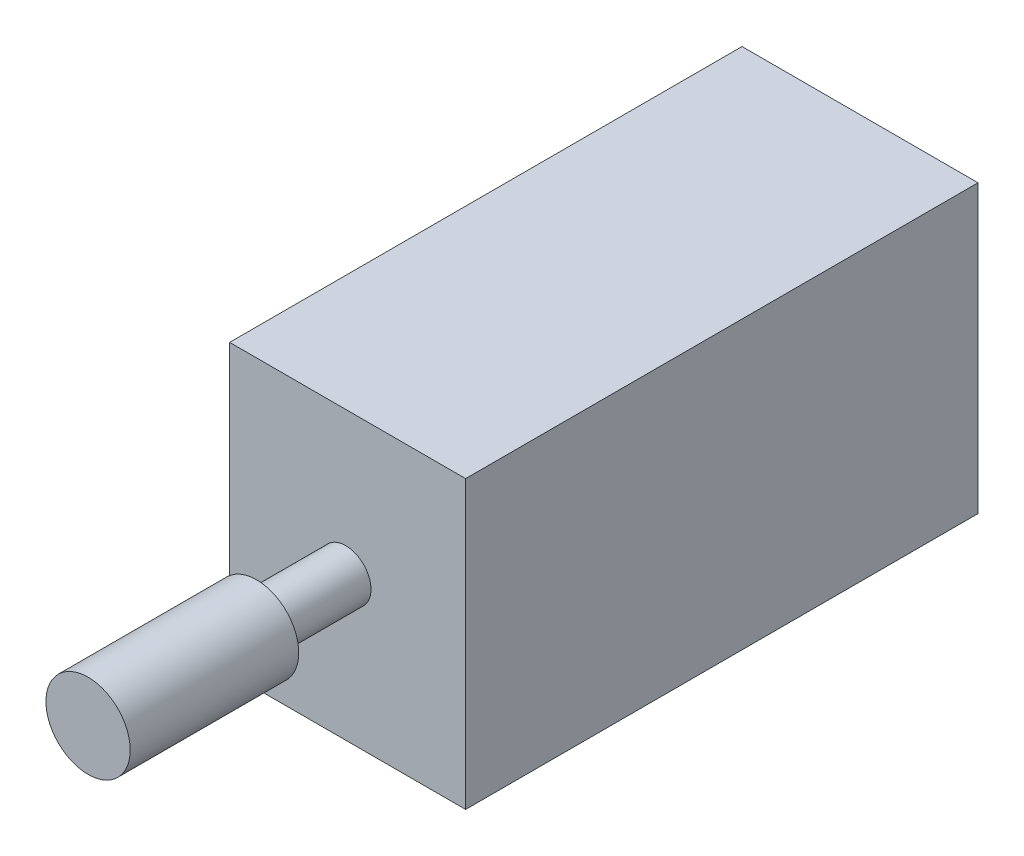
ISO-10303-21;
HEADER;
FILE_DESCRIPTION(('STEP AP214'),'2;1');
FILE_NAME('part.step','',(''),(''),'','','');
FILE_SCHEMA(('AUTOMOTIVE_DESIGN { 1 0 10303 214 1 1 1 1 }'));
ENDSEC;
DATA;
#1=APPLICATION_CONTEXT('core data for automotive mechanical design processes');
#2=APPLICATION_PROTOCOL_DEFINITION('international standard','automotive_design',2000,#1);
#3=PRODUCT_CONTEXT('',#1,'mechanical');
#4=PRODUCT('Part','Part','',(#3));
#5=PRODUCT_RELATED_PRODUCT_CATEGORY('part','',(#4));
#6=PRODUCT_DEFINITION_FORMATION('','',#4);
#7=PRODUCT_DEFINITION_CONTEXT('part definition',#1,'design');
#8=PRODUCT_DEFINITION('design','',#6,#7);
#9=PRODUCT_DEFINITION_SHAPE('','',#8);
#10=(LENGTH_UNIT() NAMED_UNIT(*) SI_UNIT(.MILLI.,.METRE.));
#11=(NAMED_UNIT(*) PLANE_ANGLE_UNIT() SI_UNIT($,.RADIAN.));
#12=(NAMED_UNIT(*) SI_UNIT($,.STERADIAN.) SOLID_ANGLE_UNIT());
#13=UNCERTAINTY_MEASURE_WITH_UNIT(LENGTH_MEASURE(1.E-05),#10,'distance_accuracy_value','');
#14=(GEOMETRIC_REPRESENTATION_CONTEXT(3) GLOBAL_UNCERTAINTY_ASSIGNED_CONTEXT((#13)) GLOBAL_UNIT_ASSIGNED_CONTEXT((#10,
#11,#12)) REPRESENTATION_CONTEXT('',''));
#15=CARTESIAN_POINT('',(0.,0.,0.));
#16=DIRECTION('',(0.,0.,1.));
#17=DIRECTION('',(1.,0.,0.));
#18=AXIS2_PLACEMENT_3D('',#15,#16,#17);
#19=CARTESIAN_POINT('',(14.,-8.49999999999992,15.2));
#20=DIRECTION('',(0.,0.,-1.));
#21=DIRECTION('',(-1.,0.,0.));
#22=AXIS2_PLACEMENT_3D('',#19,#20,#21);
#23=PLANE('',#22);
#24=CARTESIAN_POINT('',(6.88711981007908,0.,15.2));
#25=DIRECTION('',(0.,0.,-1.));
#26=DIRECTION('',(-1.,0.,0.));
#27=AXIS2_PLACEMENT_3D('',#24,#25,#26);
#28=CIRCLE('',#27,1.5);
#29=CARTESIAN_POINT('',(5.38711981007908,0.,15.2));
#30=VERTEX_POINT('',#29);
#31=EDGE_CURVE('E11',#30,#30,#28,.F.);
#32=ORIENTED_EDGE('',*,*,#31,.F.);
#33=EDGE_LOOP('',(#32));
#34=FACE_BOUND('',#33,.T.);
#35=DIRECTION('',(0.,-1.,0.));
#36=VECTOR('',#35,1.);
#37=CARTESIAN_POINT('',(0.,-8.49999999999992,15.2));
#38=LINE('',#37,#36);
#39=CARTESIAN_POINT('',(0.,8.50000000000004,15.2));
#40=VERTEX_POINT('',#39);
#41=CARTESIAN_POINT('',(0.,-8.49999999999992,15.2));
#42=VERTEX_POINT('',#41);
#43=EDGE_CURVE('E110',#40,#42,#38,.T.);
#44=ORIENTED_EDGE('',*,*,#43,.T.);
#45=DIRECTION('',(-1.,0.,0.));
#46=VECTOR('',#45,1.);
#47=CARTESIAN_POINT('',(14.,-8.49999999999992,15.2));
#48=LINE('',#47,#46);
#49=CARTESIAN_POINT('',(14.,-8.49999999999992,15.2));
#50=VERTEX_POINT('',#49);
#51=EDGE_CURVE('E48',#50,#42,#48,.T.);
#52=ORIENTED_EDGE('',*,*,#51,.F.);
#53=DIRECTION('',(0.,-1.,0.));
#54=VECTOR('',#53,1.);
#55=CARTESIAN_POINT('',(14.,-8.49999999999992,15.2));
#56=LINE('',#55,#54);
#57=CARTESIAN_POINT('',(14.,8.50000000000004,15.2));
#58=VERTEX_POINT('',#57);
#59=EDGE_CURVE('E92',#58,#50,#56,.T.);
#60=ORIENTED_EDGE('',*,*,#59,.F.);
#61=DIRECTION('',(-1.,0.,0.));
#62=VECTOR('',#61,1.);
#63=CARTESIAN_POINT('',(14.,8.50000000000004,15.2));
#64=LINE('',#63,#62);
#65=EDGE_CURVE('E106',#58,#40,#64,.T.);
#66=ORIENTED_EDGE('',*,*,#65,.T.);
#67=EDGE_LOOP('',(#44,#52,#60,#66));
#68=FACE_BOUND('',#67,.T.);
#69=ADVANCED_FACE('F39',(#34,#68),#23,.F.);
#70=CARTESIAN_POINT('',(14.,-8.49999999999992,-15.2));
#71=DIRECTION('',(0.,1.,0.));
#72=DIRECTION('',(0.,0.,1.));
#73=AXIS2_PLACEMENT_3D('',#70,#71,#72);
#74=PLANE('',#73);
#75=DIRECTION('',(0.,0.,-1.));
#76=VECTOR('',#75,1.);
#77=CARTESIAN_POINT('',(0.,-8.49999999999992,-15.2));
#78=LINE('',#77,#76);
#79=CARTESIAN_POINT('',(0.,-8.49999999999992,-15.2));
#80=VERTEX_POINT('',#79);
#81=EDGE_CURVE('E98',#42,#80,#78,.T.);
#82=ORIENTED_EDGE('',*,*,#81,.T.);
#83=DIRECTION('',(-1.,0.,0.));
#84=VECTOR('',#83,1.);
#85=CARTESIAN_POINT('',(14.,-8.49999999999992,-15.2));
#86=LINE('',#85,#84);
#87=CARTESIAN_POINT('',(14.,-8.49999999999992,-15.2));
#88=VERTEX_POINT('',#87);
#89=EDGE_CURVE('E96',#88,#80,#86,.T.);
#90=ORIENTED_EDGE('',*,*,#89,.F.);
#91=DIRECTION('',(0.,0.,-1.));
#92=VECTOR('',#91,1.);
#93=CARTESIAN_POINT('',(14.,-8.49999999999992,-15.2));
#94=LINE('',#93,#92);
#95=EDGE_CURVE('E87',#50,#88,#94,.T.);
#96=ORIENTED_EDGE('',*,*,#95,.F.);
#97=ORIENTED_EDGE('',*,*,#51,.T.);
#98=EDGE_LOOP('',(#82,#90,#96,#97));
#99=FACE_BOUND('',#98,.T.);
#100=ADVANCED_FACE('F97',(#99),#74,.F.);
#101=CARTESIAN_POINT('',(14.,-8.49999999999992,-15.2));
#102=DIRECTION('',(0.,0.,1.));
#103=DIRECTION('',(1.,0.,0.));
#104=AXIS2_PLACEMENT_3D('',#101,#102,#103);
#105=PLANE('',#104);
#106=DIRECTION('',(0.,1.,0.));
#107=VECTOR('',#106,1.);
#108=CARTESIAN_POINT('',(0.,-8.49999999999992,-15.2));
#109=LINE('',#108,#107);
#110=CARTESIAN_POINT('',(0.,8.50000000000006,-15.2));
#111=VERTEX_POINT('',#110);
#112=EDGE_CURVE('E73',#80,#111,#109,.T.);
#113=ORIENTED_EDGE('',*,*,#112,.T.);
#114=DIRECTION('',(-1.,0.,0.));
#115=VECTOR('',#114,1.);
#116=CARTESIAN_POINT('',(14.,8.50000000000006,-15.2));
#117=LINE('',#116,#115);
#118=CARTESIAN_POINT('',(14.,8.50000000000006,-15.2));
#119=VERTEX_POINT('',#118);
#120=EDGE_CURVE('E100',#119,#111,#117,.T.);
#121=ORIENTED_EDGE('',*,*,#120,.F.);
#122=DIRECTION('',(0.,1.,0.));
#123=VECTOR('',#122,1.);
#124=CARTESIAN_POINT('',(14.,-8.49999999999992,-15.2));
#125=LINE('',#124,#123);
#126=EDGE_CURVE('E90',#88,#119,#125,.T.);
#127=ORIENTED_EDGE('',*,*,#126,.F.);
#128=ORIENTED_EDGE('',*,*,#89,.T.);
#129=EDGE_LOOP('',(#113,#121,#127,#128));
#130=FACE_BOUND('',#129,.T.);
#131=ADVANCED_FACE('F102',(#130),#105,.F.);
#132=CARTESIAN_POINT('',(14.,8.50000000000006,-15.2));
#133=DIRECTION('',(0.,-1.,0.));
#134=DIRECTION('',(0.,0.,-1.));
#135=AXIS2_PLACEMENT_3D('',#132,#133,#134);
#136=PLANE('',#135);
#137=DIRECTION('',(0.,0.,1.));
#138=VECTOR('',#137,1.);
#139=CARTESIAN_POINT('',(0.,8.50000000000006,-15.2));
#140=LINE('',#139,#138);
#141=EDGE_CURVE('E79',#111,#40,#140,.T.);
#142=ORIENTED_EDGE('',*,*,#141,.T.);
#143=ORIENTED_EDGE('',*,*,#65,.F.);
#144=DIRECTION('',(0.,0.,1.));
#145=VECTOR('',#144,1.);
#146=CARTESIAN_POINT('',(14.,8.50000000000006,-15.2));
#147=LINE('',#146,#145);
#148=EDGE_CURVE('E56',#119,#58,#147,.T.);
#149=ORIENTED_EDGE('',*,*,#148,.F.);
#150=ORIENTED_EDGE('',*,*,#120,.T.);
#151=EDGE_LOOP('',(#142,#143,#149,#150));
#152=FACE_BOUND('',#151,.T.);
#153=ADVANCED_FACE('F139',(#152),#136,.F.);
#154=CARTESIAN_POINT('',(14.,0.,0.));
#155=DIRECTION('',(1.,0.,0.));
#156=DIRECTION('',(0.,0.,-1.));
#157=AXIS2_PLACEMENT_3D('',#154,#155,#156);
#158=PLANE('',#157);
#159=ORIENTED_EDGE('',*,*,#59,.T.);
#160=ORIENTED_EDGE('',*,*,#95,.T.);
#161=ORIENTED_EDGE('',*,*,#126,.T.);
#162=ORIENTED_EDGE('',*,*,#148,.T.);
#163=EDGE_LOOP('',(#159,#160,#161,#162));
#164=FACE_BOUND('',#163,.T.);
#165=ADVANCED_FACE('F88',(#164),#158,.T.);
#166=CARTESIAN_POINT('',(0.,0.,0.));
#167=DIRECTION('',(1.,0.,0.));
#168=DIRECTION('',(0.,0.,-1.));
#169=AXIS2_PLACEMENT_3D('',#166,#167,#168);
#170=PLANE('',#169);
#171=ORIENTED_EDGE('',*,*,#43,.F.);
#172=ORIENTED_EDGE('',*,*,#141,.F.);
#173=ORIENTED_EDGE('',*,*,#112,.F.);
#174=ORIENTED_EDGE('',*,*,#81,.F.);
#175=EDGE_LOOP('',(#171,#172,#173,#174));
#176=FACE_BOUND('',#175,.T.);
#177=ADVANCED_FACE('F128',(#176),#170,.F.);
#178=CARTESIAN_POINT('',(6.88711981007908,0.,20.6));
#179=DIRECTION('',(0.,0.,-1.));
#180=DIRECTION('',(-1.,0.,0.));
#181=AXIS2_PLACEMENT_3D('',#178,#179,#180);
#182=CYLINDRICAL_SURFACE('',#181,1.5);
#183=CARTESIAN_POINT('',(6.88711981007908,0.,20.6));
#184=DIRECTION('',(0.,0.,1.));
#185=DIRECTION('',(1.,0.,0.));
#186=AXIS2_PLACEMENT_3D('',#183,#184,#185);
#187=CIRCLE('',#186,1.5);
#188=CARTESIAN_POINT('',(5.38711981007908,0.,20.6));
#189=VERTEX_POINT('',#188);
#190=EDGE_CURVE('E114',#189,#189,#187,.T.);
#191=CARTESIAN_POINT('',(5.38711981007908,0.,20.6));
#192=CARTESIAN_POINT('',(5.38711981007908,0.,20.54375));
#193=CARTESIAN_POINT('',(5.38711981007908,0.,20.4875));
#194=CARTESIAN_POINT('',(5.38711981007908,0.,20.375));
#195=CARTESIAN_POINT('',(5.38711981007908,0.,20.31875));
#196=CARTESIAN_POINT('',(5.38711981007908,0.,20.20625));
#197=CARTESIAN_POINT('',(5.38711981007908,0.,20.15));
#198=CARTESIAN_POINT('',(5.38711981007908,0.,20.0375));
#199=CARTESIAN_POINT('',(5.38711981007908,0.,19.98125));
#200=CARTESIAN_POINT('',(5.38711981007908,0.,19.86875));
#201=CARTESIAN_POINT('',(5.38711981007908,0.,19.8125));
#202=CARTESIAN_POINT('',(5.38711981007908,0.,19.7));
#203=CARTESIAN_POINT('',(5.38711981007908,0.,19.64375));
#204=CARTESIAN_POINT('',(5.38711981007908,0.,19.53125));
#205=CARTESIAN_POINT('',(5.38711981007908,0.,19.475));
#206=CARTESIAN_POINT('',(5.38711981007908,0.,19.3625));
#207=CARTESIAN_POINT('',(5.38711981007908,0.,19.30625));
#208=CARTESIAN_POINT('',(5.38711981007908,0.,19.19375));
#209=CARTESIAN_POINT('',(5.38711981007908,0.,19.1375));
#210=CARTESIAN_POINT('',(5.38711981007908,0.,19.025));
#211=CARTESIAN_POINT('',(5.38711981007908,0.,18.96875));
#212=CARTESIAN_POINT('',(5.38711981007908,0.,18.85625));
#213=CARTESIAN_POINT('',(5.38711981007908,0.,18.8));
#214=CARTESIAN_POINT('',(5.38711981007908,0.,18.6875));
#215=CARTESIAN_POINT('',(5.38711981007908,0.,18.63125));
#216=CARTESIAN_POINT('',(5.38711981007908,0.,18.51875));
#217=CARTESIAN_POINT('',(5.38711981007908,0.,18.4625));
#218=CARTESIAN_POINT('',(5.38711981007908,0.,18.35));
#219=CARTESIAN_POINT('',(5.38711981007908,0.,18.29375));
#220=CARTESIAN_POINT('',(5.38711981007908,0.,18.18125));
#221=CARTESIAN_POINT('',(5.38711981007908,0.,18.125));
#222=CARTESIAN_POINT('',(5.38711981007908,0.,18.0125));
#223=CARTESIAN_POINT('',(5.38711981007908,0.,17.95625));
#224=CARTESIAN_POINT('',(5.38711981007908,0.,17.84375));
#225=CARTESIAN_POINT('',(5.38711981007908,0.,17.7875));
#226=CARTESIAN_POINT('',(5.38711981007908,0.,17.675));
#227=CARTESIAN_POINT('',(5.38711981007908,0.,17.61875));
#228=CARTESIAN_POINT('',(5.38711981007908,0.,17.50625));
#229=CARTESIAN_POINT('',(5.38711981007908,0.,17.45));
#230=CARTESIAN_POINT('',(5.38711981007908,0.,17.3375));
#231=CARTESIAN_POINT('',(5.38711981007908,0.,17.28125));
#232=CARTESIAN_POINT('',(5.38711981007908,0.,17.16875));
#233=CARTESIAN_POINT('',(5.38711981007908,0.,17.1125));
#234=CARTESIAN_POINT('',(5.38711981007908,0.,17.));
#235=CARTESIAN_POINT('',(5.38711981007908,0.,16.94375));
#236=CARTESIAN_POINT('',(5.38711981007908,0.,16.83125));
#237=CARTESIAN_POINT('',(5.38711981007908,0.,16.775));
#238=CARTESIAN_POINT('',(5.38711981007908,0.,16.6625));
#239=CARTESIAN_POINT('',(5.38711981007908,0.,16.60625));
#240=CARTESIAN_POINT('',(5.38711981007908,0.,16.49375));
#241=CARTESIAN_POINT('',(5.38711981007908,0.,16.4375));
#242=CARTESIAN_POINT('',(5.38711981007908,0.,16.325));
#243=CARTESIAN_POINT('',(5.38711981007908,0.,16.26875));
#244=CARTESIAN_POINT('',(5.38711981007908,0.,16.15625));
#245=CARTESIAN_POINT('',(5.38711981007908,0.,16.1));
#246=CARTESIAN_POINT('',(5.38711981007908,0.,15.9875));
#247=CARTESIAN_POINT('',(5.38711981007908,0.,15.93125));
#248=CARTESIAN_POINT('',(5.38711981007908,0.,15.81875));
#249=CARTESIAN_POINT('',(5.38711981007908,0.,15.7625));
#250=CARTESIAN_POINT('',(5.38711981007908,0.,15.65));
#251=CARTESIAN_POINT('',(5.38711981007908,0.,15.59375));
#252=CARTESIAN_POINT('',(5.38711981007908,0.,15.48125));
#253=CARTESIAN_POINT('',(5.38711981007908,0.,15.425));
#254=CARTESIAN_POINT('',(5.38711981007908,0.,15.3125));
#255=CARTESIAN_POINT('',(5.38711981007908,0.,15.25625));
#256=CARTESIAN_POINT('',(5.38711981007908,0.,15.2));
#257=B_SPLINE_CURVE_WITH_KNOTS('',3,(#191,#192,#193,#194,#195,#196,#197,#198,#199,#200,#201,
#202,#203,#204,#205,#206,#207,#208,#209,#210,#211,#212,#213,#214,#215,#216,#217,#218,#219,#220,
#221,#222,#223,#224,#225,#226,#227,#228,#229,#230,#231,#232,#233,#234,#235,#236,#237,#238,#239,
#240,#241,#242,#243,#244,#245,#246,#247,#248,#249,#250,#251,#252,#253,#254,#255,#256),
.UNSPECIFIED.,.F.,.F.,(4,2,2,2,2,2,2,2,2,2,2,2,2,2,2,2,2,2,2,2,2,2,2,2,2,2,2,2,2,2,2,2,4),(0.,
0.168749999999999,0.337499999999998,0.506249999999996,0.674999999999998,0.843749999999997,
1.0125,1.18125,1.35,1.51875,1.6875,1.85625,2.025,2.19375,2.3625,2.53125,2.7,2.86875,3.0375,
3.20625,3.375,3.54374999999999,3.7125,3.88125,4.04999999999999,4.21875,4.3875,4.55624999999999,
4.725,4.89375,5.06249999999999,5.23124999999999,5.4),.UNSPECIFIED.);
#258=EDGE_CURVE('BSEAM130',#189,#30,#257,.T.);
#259=ORIENTED_EDGE('',*,*,#190,.F.);
#260=ORIENTED_EDGE('',*,*,#31,.T.);
#261=ORIENTED_EDGE('',*,*,#258,.T.);
#262=ORIENTED_EDGE('',*,*,#258,.F.);
#263=EDGE_LOOP('',(#259,#261,#260,#262));
#264=FACE_BOUND('',#263,.T.);
#265=ADVANCED_FACE('F130',(#264),#182,.T.);
#266=CARTESIAN_POINT('',(7.,0.,30.6));
#267=DIRECTION('',(0.,0.,-1.));
#268=DIRECTION('',(-1.,0.,0.));
#269=AXIS2_PLACEMENT_3D('',#266,#267,#268);
#270=CYLINDRICAL_SURFACE('',#269,2.5);
#271=CARTESIAN_POINT('',(7.,0.,30.6));
#272=DIRECTION('',(0.,0.,1.));
#273=DIRECTION('',(1.,0.,0.));
#274=AXIS2_PLACEMENT_3D('',#271,#272,#273);
#275=CIRCLE('',#274,2.5);
#276=CARTESIAN_POINT('',(9.5,0.,30.6));
#277=VERTEX_POINT('',#276);
#278=EDGE_CURVE('E218',#277,#277,#275,.T.);
#279=ORIENTED_EDGE('',*,*,#278,.F.);
#280=EDGE_LOOP('',(#279));
#281=FACE_BOUND('',#280,.T.);
#282=CARTESIAN_POINT('',(7.,0.,20.6));
#283=DIRECTION('',(0.,0.,1.));
#284=DIRECTION('',(1.,0.,0.));
#285=AXIS2_PLACEMENT_3D('',#282,#283,#284);
#286=CIRCLE('',#285,2.5);
#287=CARTESIAN_POINT('',(9.5,0.,20.6));
#288=VERTEX_POINT('',#287);
#289=EDGE_CURVE('E215',#288,#288,#286,.T.);
#290=ORIENTED_EDGE('',*,*,#289,.T.);
#291=EDGE_LOOP('',(#290));
#292=FACE_BOUND('',#291,.T.);
#293=ADVANCED_FACE('F136',(#281,#292),#270,.T.);
#294=CARTESIAN_POINT('',(7.,0.,30.6));
#295=DIRECTION('',(0.,0.,1.));
#296=DIRECTION('',(1.,0.,0.));
#297=AXIS2_PLACEMENT_3D('',#294,#295,#296);
#298=PLANE('',#297);
#299=ORIENTED_EDGE('',*,*,#278,.T.);
#300=EDGE_LOOP('',(#299));
#301=FACE_BOUND('',#300,.T.);
#302=ADVANCED_FACE('F186',(#301),#298,.T.);
#303=CARTESIAN_POINT('',(7.,0.,20.6));
#304=DIRECTION('',(0.,0.,1.));
#305=DIRECTION('',(1.,0.,0.));
#306=AXIS2_PLACEMENT_3D('',#303,#304,#305);
#307=PLANE('',#306);
#308=ORIENTED_EDGE('',*,*,#190,.T.);
#309=EDGE_LOOP('',(#308));
#310=FACE_BOUND('',#309,.T.);
#311=ORIENTED_EDGE('',*,*,#289,.F.);
#312=EDGE_LOOP('',(#311));
#313=FACE_BOUND('',#312,.T.);
#314=ADVANCED_FACE('F196',(#310,#313),#307,.F.);
#315=CLOSED_SHELL('',(#69,#100,#131,#153,#165,#177,#265,#293,#302,#314));
#316=MANIFOLD_SOLID_BREP('B2',#315);
#317=ADVANCED_BREP_SHAPE_REPRESENTATION('',(#18,#316),#14);
#318=SHAPE_DEFINITION_REPRESENTATION(#9,#317);
ENDSEC;
END-ISO-10303-21;
